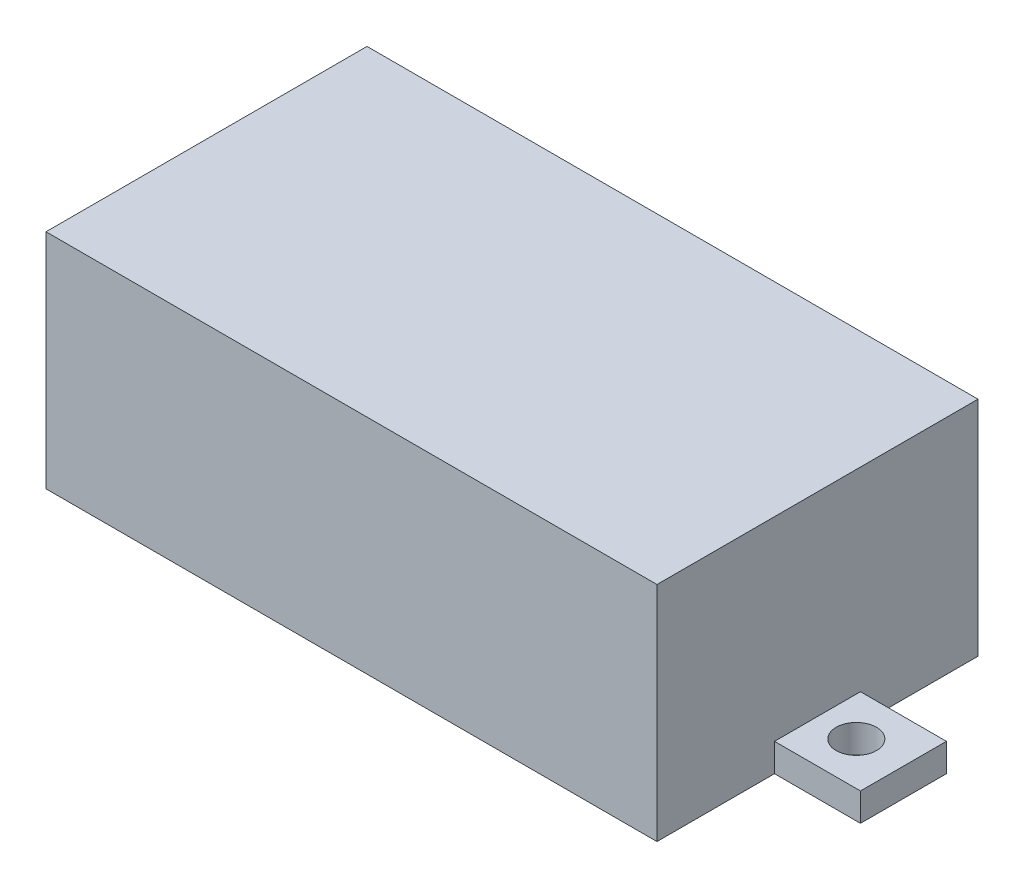
ISO-10303-21;
HEADER;
FILE_DESCRIPTION(('STEP AP214'),'2;1');
FILE_NAME('part.step','',(''),(''),'','','');
FILE_SCHEMA(('AUTOMOTIVE_DESIGN { 1 0 10303 214 1 1 1 1 }'));
ENDSEC;
DATA;
#1=APPLICATION_CONTEXT('core data for automotive mechanical design processes');
#2=APPLICATION_PROTOCOL_DEFINITION('international standard','automotive_design',2000,#1);
#3=PRODUCT_CONTEXT('',#1,'mechanical');
#4=PRODUCT('Part','Part','',(#3));
#5=PRODUCT_RELATED_PRODUCT_CATEGORY('part','',(#4));
#6=PRODUCT_DEFINITION_FORMATION('','',#4);
#7=PRODUCT_DEFINITION_CONTEXT('part definition',#1,'design');
#8=PRODUCT_DEFINITION('design','',#6,#7);
#9=PRODUCT_DEFINITION_SHAPE('','',#8);
#10=(LENGTH_UNIT() NAMED_UNIT(*) SI_UNIT(.MILLI.,.METRE.));
#11=(NAMED_UNIT(*) PLANE_ANGLE_UNIT() SI_UNIT($,.RADIAN.));
#12=(NAMED_UNIT(*) SI_UNIT($,.STERADIAN.) SOLID_ANGLE_UNIT());
#13=UNCERTAINTY_MEASURE_WITH_UNIT(LENGTH_MEASURE(1.E-05),#10,'distance_accuracy_value','');
#14=(GEOMETRIC_REPRESENTATION_CONTEXT(3) GLOBAL_UNCERTAINTY_ASSIGNED_CONTEXT((#13)) GLOBAL_UNIT_ASSIGNED_CONTEXT((#10,
#11,#12)) REPRESENTATION_CONTEXT('',''));
#15=CARTESIAN_POINT('',(0.,0.,0.));
#16=DIRECTION('',(0.,0.,1.));
#17=DIRECTION('',(1.,0.,0.));
#18=AXIS2_PLACEMENT_3D('',#15,#16,#17);
#19=CARTESIAN_POINT('',(29.5,21.5,15.5));
#20=DIRECTION('',(-1.,0.,0.));
#21=DIRECTION('',(0.,0.,1.));
#22=AXIS2_PLACEMENT_3D('',#19,#20,#21);
#23=PLANE('',#22);
#24=DIRECTION('',(0.,-1.,0.));
#25=VECTOR('',#24,1.);
#26=CARTESIAN_POINT('',(29.5,2.71,4.15000000000001));
#27=LINE('',#26,#25);
#28=CARTESIAN_POINT('',(29.5,2.71,4.15000000000001));
#29=VERTEX_POINT('',#28);
#30=CARTESIAN_POINT('',(29.5,0.,4.15000000000001));
#31=VERTEX_POINT('',#30);
#32=EDGE_CURVE('E139',#29,#31,#27,.T.);
#33=ORIENTED_EDGE('',*,*,#32,.F.);
#34=DIRECTION('',(0.,0.,-1.));
#35=VECTOR('',#34,1.);
#36=CARTESIAN_POINT('',(29.5,2.71,-4.14999999999999));
#37=LINE('',#36,#35);
#38=CARTESIAN_POINT('',(29.5,2.71,-4.14999999999999));
#39=VERTEX_POINT('',#38);
#40=EDGE_CURVE('E132',#29,#39,#37,.T.);
#41=ORIENTED_EDGE('',*,*,#40,.T.);
#42=DIRECTION('',(0.,-1.,0.));
#43=VECTOR('',#42,1.);
#44=CARTESIAN_POINT('',(29.5,2.71,-4.14999999999999));
#45=LINE('',#44,#43);
#46=CARTESIAN_POINT('',(29.5,0.,-4.15));
#47=VERTEX_POINT('',#46);
#48=EDGE_CURVE('E118',#39,#47,#45,.T.);
#49=ORIENTED_EDGE('',*,*,#48,.T.);
#50=DIRECTION('',(0.,0.,-1.));
#51=VECTOR('',#50,1.);
#52=CARTESIAN_POINT('',(29.5,0.,15.5));
#53=LINE('',#52,#51);
#54=CARTESIAN_POINT('',(29.5,0.,-15.5));
#55=VERTEX_POINT('',#54);
#56=EDGE_CURVE('E187',#47,#55,#53,.T.);
#57=ORIENTED_EDGE('',*,*,#56,.T.);
#58=DIRECTION('',(0.,-1.,0.));
#59=VECTOR('',#58,1.);
#60=CARTESIAN_POINT('',(29.5,21.5,-15.5));
#61=LINE('',#60,#59);
#62=CARTESIAN_POINT('',(29.5,21.5,-15.5));
#63=VERTEX_POINT('',#62);
#64=EDGE_CURVE('E11',#63,#55,#61,.T.);
#65=ORIENTED_EDGE('',*,*,#64,.F.);
#66=DIRECTION('',(0.,0.,-1.));
#67=VECTOR('',#66,1.);
#68=CARTESIAN_POINT('',(29.5,21.5,15.5));
#69=LINE('',#68,#67);
#70=CARTESIAN_POINT('',(29.5,21.5,15.5));
#71=VERTEX_POINT('',#70);
#72=EDGE_CURVE('E193',#71,#63,#69,.T.);
#73=ORIENTED_EDGE('',*,*,#72,.F.);
#74=DIRECTION('',(0.,-1.,0.));
#75=VECTOR('',#74,1.);
#76=CARTESIAN_POINT('',(29.5,21.5,15.5));
#77=LINE('',#76,#75);
#78=CARTESIAN_POINT('',(29.5,0.,15.5));
#79=VERTEX_POINT('',#78);
#80=EDGE_CURVE('E203',#71,#79,#77,.T.);
#81=ORIENTED_EDGE('',*,*,#80,.T.);
#82=EDGE_CURVE('E204',#79,#31,#53,.T.);
#83=ORIENTED_EDGE('',*,*,#82,.T.);
#84=EDGE_LOOP('',(#33,#41,#49,#57,#65,#73,#81,#83));
#85=FACE_BOUND('',#84,.T.);
#86=ADVANCED_FACE('F32',(#85),#23,.F.);
#87=CARTESIAN_POINT('',(-29.5,21.5,15.5));
#88=DIRECTION('',(1.,0.,0.));
#89=DIRECTION('',(0.,0.,-1.));
#90=AXIS2_PLACEMENT_3D('',#87,#88,#89);
#91=PLANE('',#90);
#92=DIRECTION('',(0.,-1.,0.));
#93=VECTOR('',#92,1.);
#94=CARTESIAN_POINT('',(-29.5,2.71,-4.15));
#95=LINE('',#94,#93);
#96=CARTESIAN_POINT('',(-29.5,2.71,-4.15));
#97=VERTEX_POINT('',#96);
#98=CARTESIAN_POINT('',(-29.5,0.,-4.15));
#99=VERTEX_POINT('',#98);
#100=EDGE_CURVE('E185',#97,#99,#95,.T.);
#101=ORIENTED_EDGE('',*,*,#100,.F.);
#102=DIRECTION('',(0.,0.,1.));
#103=VECTOR('',#102,1.);
#104=CARTESIAN_POINT('',(-29.5,2.71,-4.15));
#105=LINE('',#104,#103);
#106=CARTESIAN_POINT('',(-29.5,2.71,4.15));
#107=VERTEX_POINT('',#106);
#108=EDGE_CURVE('E165',#97,#107,#105,.T.);
#109=ORIENTED_EDGE('',*,*,#108,.T.);
#110=DIRECTION('',(0.,-1.,0.));
#111=VECTOR('',#110,1.);
#112=CARTESIAN_POINT('',(-29.5,2.71,4.15));
#113=LINE('',#112,#111);
#114=CARTESIAN_POINT('',(-29.5,0.,4.15));
#115=VERTEX_POINT('',#114);
#116=EDGE_CURVE('E178',#107,#115,#113,.T.);
#117=ORIENTED_EDGE('',*,*,#116,.T.);
#118=DIRECTION('',(0.,0.,1.));
#119=VECTOR('',#118,1.);
#120=CARTESIAN_POINT('',(-29.5,0.,15.5));
#121=LINE('',#120,#119);
#122=CARTESIAN_POINT('',(-29.5,0.,15.5));
#123=VERTEX_POINT('',#122);
#124=EDGE_CURVE('E208',#115,#123,#121,.T.);
#125=ORIENTED_EDGE('',*,*,#124,.T.);
#126=DIRECTION('',(0.,-1.,0.));
#127=VECTOR('',#126,1.);
#128=CARTESIAN_POINT('',(-29.5,21.5,15.5));
#129=LINE('',#128,#127);
#130=CARTESIAN_POINT('',(-29.5,21.5,15.5));
#131=VERTEX_POINT('',#130);
#132=EDGE_CURVE('E215',#131,#123,#129,.T.);
#133=ORIENTED_EDGE('',*,*,#132,.F.);
#134=DIRECTION('',(0.,0.,1.));
#135=VECTOR('',#134,1.);
#136=CARTESIAN_POINT('',(-29.5,21.5,15.5));
#137=LINE('',#136,#135);
#138=CARTESIAN_POINT('',(-29.5,21.5,-15.5));
#139=VERTEX_POINT('',#138);
#140=EDGE_CURVE('E199',#139,#131,#137,.T.);
#141=ORIENTED_EDGE('',*,*,#140,.F.);
#142=DIRECTION('',(0.,-1.,0.));
#143=VECTOR('',#142,1.);
#144=CARTESIAN_POINT('',(-29.5,21.5,-15.5));
#145=LINE('',#144,#143);
#146=CARTESIAN_POINT('',(-29.5,0.,-15.5));
#147=VERTEX_POINT('',#146);
#148=EDGE_CURVE('E39',#139,#147,#145,.T.);
#149=ORIENTED_EDGE('',*,*,#148,.T.);
#150=EDGE_CURVE('E209',#147,#99,#121,.T.);
#151=ORIENTED_EDGE('',*,*,#150,.T.);
#152=EDGE_LOOP('',(#101,#109,#117,#125,#133,#141,#149,#151));
#153=FACE_BOUND('',#152,.T.);
#154=ADVANCED_FACE('F223',(#153),#91,.F.);
#155=CARTESIAN_POINT('',(-29.5,21.5,-15.5));
#156=DIRECTION('',(0.,0.,1.));
#157=DIRECTION('',(1.,0.,0.));
#158=AXIS2_PLACEMENT_3D('',#155,#156,#157);
#159=PLANE('',#158);
#160=DIRECTION('',(-1.,0.,0.));
#161=VECTOR('',#160,1.);
#162=CARTESIAN_POINT('',(-29.5,0.,-15.5));
#163=LINE('',#162,#161);
#164=EDGE_CURVE('E206',#55,#147,#163,.T.);
#165=ORIENTED_EDGE('',*,*,#164,.T.);
#166=ORIENTED_EDGE('',*,*,#148,.F.);
#167=DIRECTION('',(-1.,0.,0.));
#168=VECTOR('',#167,1.);
#169=CARTESIAN_POINT('',(-29.5,21.5,-15.5));
#170=LINE('',#169,#168);
#171=EDGE_CURVE('E196',#63,#139,#170,.T.);
#172=ORIENTED_EDGE('',*,*,#171,.F.);
#173=ORIENTED_EDGE('',*,*,#64,.T.);
#174=EDGE_LOOP('',(#165,#166,#172,#173));
#175=FACE_BOUND('',#174,.T.);
#176=ADVANCED_FACE('F253',(#175),#159,.F.);
#177=CARTESIAN_POINT('',(-29.5,21.5,15.5));
#178=DIRECTION('',(0.,0.,-1.));
#179=DIRECTION('',(-1.,0.,0.));
#180=AXIS2_PLACEMENT_3D('',#177,#178,#179);
#181=PLANE('',#180);
#182=DIRECTION('',(1.,0.,0.));
#183=VECTOR('',#182,1.);
#184=CARTESIAN_POINT('',(-29.5,0.,15.5));
#185=LINE('',#184,#183);
#186=EDGE_CURVE('E197',#123,#79,#185,.T.);
#187=ORIENTED_EDGE('',*,*,#186,.T.);
#188=ORIENTED_EDGE('',*,*,#80,.F.);
#189=DIRECTION('',(1.,0.,0.));
#190=VECTOR('',#189,1.);
#191=CARTESIAN_POINT('',(-29.5,21.5,15.5));
#192=LINE('',#191,#190);
#193=EDGE_CURVE('E201',#131,#71,#192,.T.);
#194=ORIENTED_EDGE('',*,*,#193,.F.);
#195=ORIENTED_EDGE('',*,*,#132,.T.);
#196=EDGE_LOOP('',(#187,#188,#194,#195));
#197=FACE_BOUND('',#196,.T.);
#198=ADVANCED_FACE('F247',(#197),#181,.F.);
#199=CARTESIAN_POINT('',(0.,21.5,0.));
#200=DIRECTION('',(0.,-1.,0.));
#201=DIRECTION('',(0.,0.,-1.));
#202=AXIS2_PLACEMENT_3D('',#199,#200,#201);
#203=PLANE('',#202);
#204=ORIENTED_EDGE('',*,*,#72,.T.);
#205=ORIENTED_EDGE('',*,*,#171,.T.);
#206=ORIENTED_EDGE('',*,*,#140,.T.);
#207=ORIENTED_EDGE('',*,*,#193,.T.);
#208=EDGE_LOOP('',(#204,#205,#206,#207));
#209=FACE_BOUND('',#208,.T.);
#210=ADVANCED_FACE('F251',(#209),#203,.F.);
#211=CARTESIAN_POINT('',(0.,0.,0.));
#212=DIRECTION('',(0.,-1.,0.));
#213=DIRECTION('',(0.,0.,-1.));
#214=AXIS2_PLACEMENT_3D('',#211,#212,#213);
#215=PLANE('',#214);
#216=ORIENTED_EDGE('',*,*,#82,.F.);
#217=ORIENTED_EDGE('',*,*,#186,.F.);
#218=ORIENTED_EDGE('',*,*,#124,.F.);
#219=DIRECTION('',(-1.,0.,0.));
#220=VECTOR('',#219,1.);
#221=CARTESIAN_POINT('',(-29.5,0.,4.15));
#222=LINE('',#221,#220);
#223=CARTESIAN_POINT('',(-37.8,0.,4.15));
#224=VERTEX_POINT('',#223);
#225=EDGE_CURVE('E54',#115,#224,#222,.T.);
#226=ORIENTED_EDGE('',*,*,#225,.T.);
#227=DIRECTION('',(0.,0.,-1.));
#228=VECTOR('',#227,1.);
#229=CARTESIAN_POINT('',(-37.8,0.,-4.15));
#230=LINE('',#229,#228);
#231=CARTESIAN_POINT('',(-37.8,0.,-4.15));
#232=VERTEX_POINT('',#231);
#233=EDGE_CURVE('E180',#224,#232,#230,.T.);
#234=ORIENTED_EDGE('',*,*,#233,.T.);
#235=DIRECTION('',(1.,0.,0.));
#236=VECTOR('',#235,1.);
#237=CARTESIAN_POINT('',(-29.5,0.,-4.15));
#238=LINE('',#237,#236);
#239=EDGE_CURVE('E169',#232,#99,#238,.T.);
#240=ORIENTED_EDGE('',*,*,#239,.T.);
#241=ORIENTED_EDGE('',*,*,#150,.F.);
#242=ORIENTED_EDGE('',*,*,#164,.F.);
#243=ORIENTED_EDGE('',*,*,#56,.F.);
#244=DIRECTION('',(1.,0.,0.));
#245=VECTOR('',#244,1.);
#246=CARTESIAN_POINT('',(29.5,0.,-4.14999999999999));
#247=LINE('',#246,#245);
#248=CARTESIAN_POINT('',(37.8,0.,-4.14999999999999));
#249=VERTEX_POINT('',#248);
#250=EDGE_CURVE('E46',#47,#249,#247,.T.);
#251=ORIENTED_EDGE('',*,*,#250,.T.);
#252=DIRECTION('',(0.,0.,1.));
#253=VECTOR('',#252,1.);
#254=CARTESIAN_POINT('',(37.8,0.,-4.14999999999999));
#255=LINE('',#254,#253);
#256=CARTESIAN_POINT('',(37.8,0.,4.15000000000001));
#257=VERTEX_POINT('',#256);
#258=EDGE_CURVE('E143',#249,#257,#255,.T.);
#259=ORIENTED_EDGE('',*,*,#258,.T.);
#260=DIRECTION('',(-1.,0.,0.));
#261=VECTOR('',#260,1.);
#262=CARTESIAN_POINT('',(29.5,0.,4.15000000000001));
#263=LINE('',#262,#261);
#264=EDGE_CURVE('E140',#257,#31,#263,.T.);
#265=ORIENTED_EDGE('',*,*,#264,.T.);
#266=EDGE_LOOP('',(#216,#217,#218,#226,#234,#240,#241,#242,#243,#251,#259,#265));
#267=FACE_BOUND('',#266,.T.);
#268=CARTESIAN_POINT('',(-33.25,0.,0.));
#269=DIRECTION('',(0.,-1.,0.));
#270=DIRECTION('',(0.,0.,-1.));
#271=AXIS2_PLACEMENT_3D('',#268,#269,#270);
#272=CIRCLE('',#271,1.95);
#273=CARTESIAN_POINT('',(-33.25,0.,-1.95));
#274=VERTEX_POINT('',#273);
#275=EDGE_CURVE('E156',#274,#274,#272,.T.);
#276=ORIENTED_EDGE('',*,*,#275,.F.);
#277=EDGE_LOOP('',(#276));
#278=FACE_BOUND('',#277,.T.);
#279=CARTESIAN_POINT('',(33.25,0.,0.));
#280=DIRECTION('',(0.,-1.,0.));
#281=DIRECTION('',(0.,0.,1.));
#282=AXIS2_PLACEMENT_3D('',#279,#280,#281);
#283=CIRCLE('',#282,1.95);
#284=CARTESIAN_POINT('',(33.25,0.,1.95000000000001));
#285=VERTEX_POINT('',#284);
#286=EDGE_CURVE('E146',#285,#285,#283,.T.);
#287=ORIENTED_EDGE('',*,*,#286,.F.);
#288=EDGE_LOOP('',(#287));
#289=FACE_BOUND('',#288,.T.);
#290=ADVANCED_FACE('F229',(#267,#278,#289),#215,.T.);
#291=CARTESIAN_POINT('',(-29.5,2.71,-4.15));
#292=DIRECTION('',(0.,0.,-1.));
#293=DIRECTION('',(-1.,0.,0.));
#294=AXIS2_PLACEMENT_3D('',#291,#292,#293);
#295=PLANE('',#294);
#296=ORIENTED_EDGE('',*,*,#239,.F.);
#297=DIRECTION('',(0.,-1.,0.));
#298=VECTOR('',#297,1.);
#299=CARTESIAN_POINT('',(-37.8,2.71,-4.15));
#300=LINE('',#299,#298);
#301=CARTESIAN_POINT('',(-37.8,2.71,-4.15));
#302=VERTEX_POINT('',#301);
#303=EDGE_CURVE('E188',#302,#232,#300,.T.);
#304=ORIENTED_EDGE('',*,*,#303,.F.);
#305=DIRECTION('',(1.,0.,0.));
#306=VECTOR('',#305,1.);
#307=CARTESIAN_POINT('',(-29.5,2.71,-4.15));
#308=LINE('',#307,#306);
#309=EDGE_CURVE('E175',#302,#97,#308,.T.);
#310=ORIENTED_EDGE('',*,*,#309,.T.);
#311=ORIENTED_EDGE('',*,*,#100,.T.);
#312=EDGE_LOOP('',(#296,#304,#310,#311));
#313=FACE_BOUND('',#312,.T.);
#314=ADVANCED_FACE('F234',(#313),#295,.T.);
#315=CARTESIAN_POINT('',(-37.8,2.71,-4.15));
#316=DIRECTION('',(-1.,0.,0.));
#317=DIRECTION('',(0.,0.,1.));
#318=AXIS2_PLACEMENT_3D('',#315,#316,#317);
#319=PLANE('',#318);
#320=ORIENTED_EDGE('',*,*,#233,.F.);
#321=DIRECTION('',(0.,-1.,0.));
#322=VECTOR('',#321,1.);
#323=CARTESIAN_POINT('',(-37.8,2.71,4.15));
#324=LINE('',#323,#322);
#325=CARTESIAN_POINT('',(-37.8,2.71,4.15));
#326=VERTEX_POINT('',#325);
#327=EDGE_CURVE('E190',#326,#224,#324,.T.);
#328=ORIENTED_EDGE('',*,*,#327,.F.);
#329=DIRECTION('',(0.,0.,-1.));
#330=VECTOR('',#329,1.);
#331=CARTESIAN_POINT('',(-37.8,2.71,-4.15));
#332=LINE('',#331,#330);
#333=EDGE_CURVE('E172',#326,#302,#332,.T.);
#334=ORIENTED_EDGE('',*,*,#333,.T.);
#335=ORIENTED_EDGE('',*,*,#303,.T.);
#336=EDGE_LOOP('',(#320,#328,#334,#335));
#337=FACE_BOUND('',#336,.T.);
#338=ADVANCED_FACE('F243',(#337),#319,.T.);
#339=CARTESIAN_POINT('',(-29.5,2.71,4.15));
#340=DIRECTION('',(0.,0.,1.));
#341=DIRECTION('',(1.,0.,0.));
#342=AXIS2_PLACEMENT_3D('',#339,#340,#341);
#343=PLANE('',#342);
#344=ORIENTED_EDGE('',*,*,#225,.F.);
#345=ORIENTED_EDGE('',*,*,#116,.F.);
#346=DIRECTION('',(-1.,0.,0.));
#347=VECTOR('',#346,1.);
#348=CARTESIAN_POINT('',(-29.5,2.71,4.15));
#349=LINE('',#348,#347);
#350=EDGE_CURVE('E168',#107,#326,#349,.T.);
#351=ORIENTED_EDGE('',*,*,#350,.T.);
#352=ORIENTED_EDGE('',*,*,#327,.T.);
#353=EDGE_LOOP('',(#344,#345,#351,#352));
#354=FACE_BOUND('',#353,.T.);
#355=ADVANCED_FACE('F241',(#354),#343,.T.);
#356=CARTESIAN_POINT('',(0.,2.71,0.));
#357=DIRECTION('',(0.,-1.,0.));
#358=DIRECTION('',(0.,0.,-1.));
#359=AXIS2_PLACEMENT_3D('',#356,#357,#358);
#360=PLANE('',#359);
#361=CARTESIAN_POINT('',(-33.25,2.71,0.));
#362=DIRECTION('',(0.,-1.,0.));
#363=DIRECTION('',(0.,0.,-1.));
#364=AXIS2_PLACEMENT_3D('',#361,#362,#363);
#365=CIRCLE('',#364,1.95);
#366=CARTESIAN_POINT('',(-33.25,2.71,-1.95));
#367=VERTEX_POINT('',#366);
#368=EDGE_CURVE('E160',#367,#367,#365,.T.);
#369=ORIENTED_EDGE('',*,*,#368,.T.);
#370=EDGE_LOOP('',(#369));
#371=FACE_BOUND('',#370,.T.);
#372=ORIENTED_EDGE('',*,*,#108,.F.);
#373=ORIENTED_EDGE('',*,*,#309,.F.);
#374=ORIENTED_EDGE('',*,*,#333,.F.);
#375=ORIENTED_EDGE('',*,*,#350,.F.);
#376=EDGE_LOOP('',(#372,#373,#374,#375));
#377=FACE_BOUND('',#376,.T.);
#378=ADVANCED_FACE('F239',(#371,#377),#360,.F.);
#379=CARTESIAN_POINT('',(-33.25,2.71,0.));
#380=DIRECTION('',(0.,-1.,0.));
#381=DIRECTION('',(0.,0.,-1.));
#382=AXIS2_PLACEMENT_3D('',#379,#380,#381);
#383=CYLINDRICAL_SURFACE('',#382,1.95);
#384=ORIENTED_EDGE('',*,*,#368,.F.);
#385=EDGE_LOOP('',(#384));
#386=FACE_BOUND('',#385,.T.);
#387=ORIENTED_EDGE('',*,*,#275,.T.);
#388=EDGE_LOOP('',(#387));
#389=FACE_BOUND('',#388,.T.);
#390=ADVANCED_FACE('F267',(#386,#389),#383,.F.);
#391=CARTESIAN_POINT('',(29.5,2.71,4.15000000000001));
#392=DIRECTION('',(0.,0.,1.));
#393=DIRECTION('',(1.,0.,0.));
#394=AXIS2_PLACEMENT_3D('',#391,#392,#393);
#395=PLANE('',#394);
#396=ORIENTED_EDGE('',*,*,#264,.F.);
#397=DIRECTION('',(0.,-1.,0.));
#398=VECTOR('',#397,1.);
#399=CARTESIAN_POINT('',(37.8,2.71,4.15000000000001));
#400=LINE('',#399,#398);
#401=CARTESIAN_POINT('',(37.8,2.71,4.15000000000001));
#402=VERTEX_POINT('',#401);
#403=EDGE_CURVE('E157',#402,#257,#400,.T.);
#404=ORIENTED_EDGE('',*,*,#403,.F.);
#405=DIRECTION('',(-1.,0.,0.));
#406=VECTOR('',#405,1.);
#407=CARTESIAN_POINT('',(29.5,2.71,4.15000000000001));
#408=LINE('',#407,#406);
#409=EDGE_CURVE('E126',#402,#29,#408,.T.);
#410=ORIENTED_EDGE('',*,*,#409,.T.);
#411=ORIENTED_EDGE('',*,*,#32,.T.);
#412=EDGE_LOOP('',(#396,#404,#410,#411));
#413=FACE_BOUND('',#412,.T.);
#414=ADVANCED_FACE('F258',(#413),#395,.T.);
#415=CARTESIAN_POINT('',(37.8,2.71,-4.14999999999999));
#416=DIRECTION('',(1.,0.,0.));
#417=DIRECTION('',(0.,0.,-1.));
#418=AXIS2_PLACEMENT_3D('',#415,#416,#417);
#419=PLANE('',#418);
#420=ORIENTED_EDGE('',*,*,#258,.F.);
#421=DIRECTION('',(0.,-1.,0.));
#422=VECTOR('',#421,1.);
#423=CARTESIAN_POINT('',(37.8,2.71,-4.14999999999999));
#424=LINE('',#423,#422);
#425=CARTESIAN_POINT('',(37.8,2.71,-4.14999999999999));
#426=VERTEX_POINT('',#425);
#427=EDGE_CURVE('E125',#426,#249,#424,.T.);
#428=ORIENTED_EDGE('',*,*,#427,.F.);
#429=DIRECTION('',(0.,0.,1.));
#430=VECTOR('',#429,1.);
#431=CARTESIAN_POINT('',(37.8,2.71,-4.14999999999999));
#432=LINE('',#431,#430);
#433=EDGE_CURVE('E135',#426,#402,#432,.T.);
#434=ORIENTED_EDGE('',*,*,#433,.T.);
#435=ORIENTED_EDGE('',*,*,#403,.T.);
#436=EDGE_LOOP('',(#420,#428,#434,#435));
#437=FACE_BOUND('',#436,.T.);
#438=ADVANCED_FACE('F259',(#437),#419,.T.);
#439=CARTESIAN_POINT('',(29.5,2.71,-4.14999999999999));
#440=DIRECTION('',(0.,0.,-1.));
#441=DIRECTION('',(-1.,0.,0.));
#442=AXIS2_PLACEMENT_3D('',#439,#440,#441);
#443=PLANE('',#442);
#444=ORIENTED_EDGE('',*,*,#250,.F.);
#445=ORIENTED_EDGE('',*,*,#48,.F.);
#446=DIRECTION('',(1.,0.,0.));
#447=VECTOR('',#446,1.);
#448=CARTESIAN_POINT('',(29.5,2.71,-4.14999999999999));
#449=LINE('',#448,#447);
#450=EDGE_CURVE('E121',#39,#426,#449,.T.);
#451=ORIENTED_EDGE('',*,*,#450,.T.);
#452=ORIENTED_EDGE('',*,*,#427,.T.);
#453=EDGE_LOOP('',(#444,#445,#451,#452));
#454=FACE_BOUND('',#453,.T.);
#455=ADVANCED_FACE('F120',(#454),#443,.T.);
#456=CARTESIAN_POINT('',(0.,2.71,0.));
#457=DIRECTION('',(0.,1.,0.));
#458=DIRECTION('',(0.,0.,1.));
#459=AXIS2_PLACEMENT_3D('',#456,#457,#458);
#460=PLANE('',#459);
#461=CARTESIAN_POINT('',(33.25,2.71,0.));
#462=DIRECTION('',(0.,-1.,0.));
#463=DIRECTION('',(0.,0.,1.));
#464=AXIS2_PLACEMENT_3D('',#461,#462,#463);
#465=CIRCLE('',#464,1.95);
#466=CARTESIAN_POINT('',(33.25,2.71,1.95000000000001));
#467=VERTEX_POINT('',#466);
#468=EDGE_CURVE('E152',#467,#467,#465,.T.);
#469=ORIENTED_EDGE('',*,*,#468,.T.);
#470=EDGE_LOOP('',(#469));
#471=FACE_BOUND('',#470,.T.);
#472=ORIENTED_EDGE('',*,*,#40,.F.);
#473=ORIENTED_EDGE('',*,*,#409,.F.);
#474=ORIENTED_EDGE('',*,*,#433,.F.);
#475=ORIENTED_EDGE('',*,*,#450,.F.);
#476=EDGE_LOOP('',(#472,#473,#474,#475));
#477=FACE_BOUND('',#476,.T.);
#478=ADVANCED_FACE('F130',(#471,#477),#460,.T.);
#479=CARTESIAN_POINT('',(33.25,2.71,0.));
#480=DIRECTION('',(0.,-1.,0.));
#481=DIRECTION('',(0.,0.,-1.));
#482=AXIS2_PLACEMENT_3D('',#479,#480,#481);
#483=CYLINDRICAL_SURFACE('',#482,1.95);
#484=ORIENTED_EDGE('',*,*,#468,.F.);
#485=EDGE_LOOP('',(#484));
#486=FACE_BOUND('',#485,.T.);
#487=ORIENTED_EDGE('',*,*,#286,.T.);
#488=EDGE_LOOP('',(#487));
#489=FACE_BOUND('',#488,.T.);
#490=ADVANCED_FACE('F308',(#486,#489),#483,.F.);
#491=CLOSED_SHELL('',(#86,#154,#176,#198,#210,#290,#314,#338,#355,#378,#390,#414,#438,#455,#478,#490));
#492=MANIFOLD_SOLID_BREP('B2',#491);
#493=ADVANCED_BREP_SHAPE_REPRESENTATION('',(#18,#492),#14);
#494=SHAPE_DEFINITION_REPRESENTATION(#9,#493);
ENDSEC;
END-ISO-10303-21;
